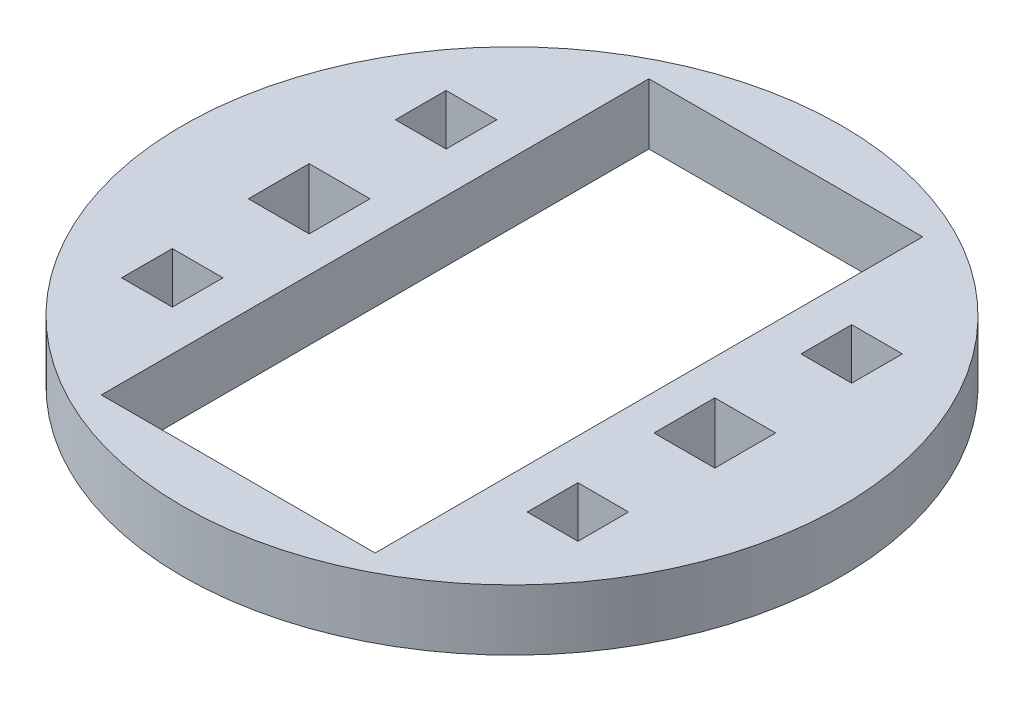
ISO-10303-21;
HEADER;
FILE_DESCRIPTION(('STEP AP214'),'2;1');
FILE_NAME('part.step','',(''),(''),'','','');
FILE_SCHEMA(('AUTOMOTIVE_DESIGN { 1 0 10303 214 1 1 1 1 }'));
ENDSEC;
DATA;
#1=APPLICATION_CONTEXT('core data for automotive mechanical design processes');
#2=APPLICATION_PROTOCOL_DEFINITION('international standard','automotive_design',2000,#1);
#3=PRODUCT_CONTEXT('',#1,'mechanical');
#4=PRODUCT('Part','Part','',(#3));
#5=PRODUCT_RELATED_PRODUCT_CATEGORY('part','',(#4));
#6=PRODUCT_DEFINITION_FORMATION('','',#4);
#7=PRODUCT_DEFINITION_CONTEXT('part definition',#1,'design');
#8=PRODUCT_DEFINITION('design','',#6,#7);
#9=PRODUCT_DEFINITION_SHAPE('','',#8);
#10=(LENGTH_UNIT() NAMED_UNIT(*) SI_UNIT(.MILLI.,.METRE.));
#11=(NAMED_UNIT(*) PLANE_ANGLE_UNIT() SI_UNIT($,.RADIAN.));
#12=(NAMED_UNIT(*) SI_UNIT($,.STERADIAN.) SOLID_ANGLE_UNIT());
#13=UNCERTAINTY_MEASURE_WITH_UNIT(LENGTH_MEASURE(1.E-05),#10,'distance_accuracy_value','');
#14=(GEOMETRIC_REPRESENTATION_CONTEXT(3) GLOBAL_UNCERTAINTY_ASSIGNED_CONTEXT((#13)) GLOBAL_UNIT_ASSIGNED_CONTEXT((#10,
#11,#12)) REPRESENTATION_CONTEXT('',''));
#15=CARTESIAN_POINT('',(0.,0.,0.));
#16=DIRECTION('',(0.,0.,1.));
#17=DIRECTION('',(1.,0.,0.));
#18=AXIS2_PLACEMENT_3D('',#15,#16,#17);
#19=CARTESIAN_POINT('',(0.,6.,0.));
#20=DIRECTION('',(0.,1.,0.));
#21=DIRECTION('',(0.,0.,1.));
#22=AXIS2_PLACEMENT_3D('',#19,#20,#21);
#23=PLANE('',#22);
#24=DIRECTION('',(0.,0.,1.));
#25=VECTOR('',#24,1.);
#26=CARTESIAN_POINT('',(17.5,6.,-16.));
#27=LINE('',#26,#25);
#28=CARTESIAN_POINT('',(17.5,6.,-16.));
#29=VERTEX_POINT('',#28);
#30=CARTESIAN_POINT('',(17.5,6.,-11.));
#31=VERTEX_POINT('',#30);
#32=EDGE_CURVE('E61',#29,#31,#27,.T.);
#33=ORIENTED_EDGE('',*,*,#32,.F.);
#34=DIRECTION('',(-1.,0.,0.));
#35=VECTOR('',#34,1.);
#36=CARTESIAN_POINT('',(22.5,6.,-16.));
#37=LINE('',#36,#35);
#38=CARTESIAN_POINT('',(22.5,6.,-16.));
#39=VERTEX_POINT('',#38);
#40=EDGE_CURVE('E294',#39,#29,#37,.T.);
#41=ORIENTED_EDGE('',*,*,#40,.F.);
#42=DIRECTION('',(0.,0.,-1.));
#43=VECTOR('',#42,1.);
#44=CARTESIAN_POINT('',(22.5,6.,-16.));
#45=LINE('',#44,#43);
#46=CARTESIAN_POINT('',(22.5,6.,-11.));
#47=VERTEX_POINT('',#46);
#48=EDGE_CURVE('E291',#47,#39,#45,.T.);
#49=ORIENTED_EDGE('',*,*,#48,.F.);
#50=DIRECTION('',(1.,0.,0.));
#51=VECTOR('',#50,1.);
#52=CARTESIAN_POINT('',(22.5,6.,-11.));
#53=LINE('',#52,#51);
#54=EDGE_CURVE('E288',#31,#47,#53,.T.);
#55=ORIENTED_EDGE('',*,*,#54,.F.);
#56=EDGE_LOOP('',(#33,#41,#49,#55));
#57=FACE_BOUND('',#56,.T.);
#58=DIRECTION('',(0.,0.,1.));
#59=VECTOR('',#58,1.);
#60=CARTESIAN_POINT('',(17.5,6.,11.));
#61=LINE('',#60,#59);
#62=CARTESIAN_POINT('',(17.5,6.,11.));
#63=VERTEX_POINT('',#62);
#64=CARTESIAN_POINT('',(17.5,6.,16.));
#65=VERTEX_POINT('',#64);
#66=EDGE_CURVE('E69',#63,#65,#61,.T.);
#67=ORIENTED_EDGE('',*,*,#66,.F.);
#68=DIRECTION('',(-1.,0.,0.));
#69=VECTOR('',#68,1.);
#70=CARTESIAN_POINT('',(22.5,6.,11.));
#71=LINE('',#70,#69);
#72=CARTESIAN_POINT('',(22.5,6.,11.));
#73=VERTEX_POINT('',#72);
#74=EDGE_CURVE('E276',#73,#63,#71,.T.);
#75=ORIENTED_EDGE('',*,*,#74,.F.);
#76=DIRECTION('',(0.,0.,-1.));
#77=VECTOR('',#76,1.);
#78=CARTESIAN_POINT('',(22.5,6.,11.));
#79=LINE('',#78,#77);
#80=CARTESIAN_POINT('',(22.5,6.,16.));
#81=VERTEX_POINT('',#80);
#82=EDGE_CURVE('E273',#81,#73,#79,.T.);
#83=ORIENTED_EDGE('',*,*,#82,.F.);
#84=DIRECTION('',(1.,0.,0.));
#85=VECTOR('',#84,1.);
#86=CARTESIAN_POINT('',(22.5,6.,16.));
#87=LINE('',#86,#85);
#88=EDGE_CURVE('E269',#65,#81,#87,.T.);
#89=ORIENTED_EDGE('',*,*,#88,.F.);
#90=EDGE_LOOP('',(#67,#75,#83,#89));
#91=FACE_BOUND('',#90,.T.);
#92=DIRECTION('',(0.,0.,1.));
#93=VECTOR('',#92,1.);
#94=CARTESIAN_POINT('',(-22.5,6.,11.));
#95=LINE('',#94,#93);
#96=CARTESIAN_POINT('',(-22.5,6.,11.));
#97=VERTEX_POINT('',#96);
#98=CARTESIAN_POINT('',(-22.5,6.,16.));
#99=VERTEX_POINT('',#98);
#100=EDGE_CURVE('E254',#97,#99,#95,.T.);
#101=ORIENTED_EDGE('',*,*,#100,.F.);
#102=DIRECTION('',(-1.,0.,0.));
#103=VECTOR('',#102,1.);
#104=CARTESIAN_POINT('',(-17.5,6.,11.));
#105=LINE('',#104,#103);
#106=CARTESIAN_POINT('',(-17.5,6.,11.));
#107=VERTEX_POINT('',#106);
#108=EDGE_CURVE('E258',#107,#97,#105,.T.);
#109=ORIENTED_EDGE('',*,*,#108,.F.);
#110=DIRECTION('',(0.,0.,-1.));
#111=VECTOR('',#110,1.);
#112=CARTESIAN_POINT('',(-17.5,6.,11.));
#113=LINE('',#112,#111);
#114=CARTESIAN_POINT('',(-17.5,6.,16.));
#115=VERTEX_POINT('',#114);
#116=EDGE_CURVE('E238',#115,#107,#113,.T.);
#117=ORIENTED_EDGE('',*,*,#116,.F.);
#118=DIRECTION('',(1.,0.,0.));
#119=VECTOR('',#118,1.);
#120=CARTESIAN_POINT('',(-17.5,6.,16.));
#121=LINE('',#120,#119);
#122=EDGE_CURVE('E249',#99,#115,#121,.T.);
#123=ORIENTED_EDGE('',*,*,#122,.F.);
#124=EDGE_LOOP('',(#101,#109,#117,#123));
#125=FACE_BOUND('',#124,.T.);
#126=DIRECTION('',(0.,0.,1.));
#127=VECTOR('',#126,1.);
#128=CARTESIAN_POINT('',(-22.5,6.,-16.));
#129=LINE('',#128,#127);
#130=CARTESIAN_POINT('',(-22.5,6.,-16.));
#131=VERTEX_POINT('',#130);
#132=CARTESIAN_POINT('',(-22.5,6.,-11.));
#133=VERTEX_POINT('',#132);
#134=EDGE_CURVE('E265',#131,#133,#129,.T.);
#135=ORIENTED_EDGE('',*,*,#134,.F.);
#136=DIRECTION('',(-1.,0.,0.));
#137=VECTOR('',#136,1.);
#138=CARTESIAN_POINT('',(-17.5,6.,-16.));
#139=LINE('',#138,#137);
#140=CARTESIAN_POINT('',(-17.5,6.,-16.));
#141=VERTEX_POINT('',#140);
#142=EDGE_CURVE('E311',#141,#131,#139,.T.);
#143=ORIENTED_EDGE('',*,*,#142,.F.);
#144=DIRECTION('',(0.,0.,-1.));
#145=VECTOR('',#144,1.);
#146=CARTESIAN_POINT('',(-17.5,6.,-16.));
#147=LINE('',#146,#145);
#148=CARTESIAN_POINT('',(-17.5,6.,-11.));
#149=VERTEX_POINT('',#148);
#150=EDGE_CURVE('E308',#149,#141,#147,.T.);
#151=ORIENTED_EDGE('',*,*,#150,.F.);
#152=DIRECTION('',(1.,0.,0.));
#153=VECTOR('',#152,1.);
#154=CARTESIAN_POINT('',(-17.5,6.,-11.));
#155=LINE('',#154,#153);
#156=EDGE_CURVE('E305',#133,#149,#155,.T.);
#157=ORIENTED_EDGE('',*,*,#156,.F.);
#158=EDGE_LOOP('',(#135,#143,#151,#157));
#159=FACE_BOUND('',#158,.T.);
#160=CARTESIAN_POINT('',(0.,6.,0.));
#161=DIRECTION('',(0.,1.,0.));
#162=DIRECTION('',(0.,0.,1.));
#163=AXIS2_PLACEMENT_3D('',#160,#161,#162);
#164=CIRCLE('',#163,32.5);
#165=CARTESIAN_POINT('',(0.,6.,32.5));
#166=VERTEX_POINT('',#165);
#167=EDGE_CURVE('E417',#166,#166,#164,.T.);
#168=ORIENTED_EDGE('',*,*,#167,.T.);
#169=EDGE_LOOP('',(#168));
#170=FACE_BOUND('',#169,.T.);
#171=DIRECTION('',(-1.,0.,0.));
#172=VECTOR('',#171,1.);
#173=CARTESIAN_POINT('',(-13.5,6.,-27.));
#174=LINE('',#173,#172);
#175=CARTESIAN_POINT('',(13.5,6.,-27.));
#176=VERTEX_POINT('',#175);
#177=CARTESIAN_POINT('',(-13.5,6.,-27.));
#178=VERTEX_POINT('',#177);
#179=EDGE_CURVE('E388',#176,#178,#174,.T.);
#180=ORIENTED_EDGE('',*,*,#179,.F.);
#181=DIRECTION('',(0.,0.,-1.));
#182=VECTOR('',#181,1.);
#183=CARTESIAN_POINT('',(13.5,6.,-27.));
#184=LINE('',#183,#182);
#185=CARTESIAN_POINT('',(13.5,6.,27.));
#186=VERTEX_POINT('',#185);
#187=EDGE_CURVE('E386',#186,#176,#184,.T.);
#188=ORIENTED_EDGE('',*,*,#187,.F.);
#189=DIRECTION('',(1.,0.,0.));
#190=VECTOR('',#189,1.);
#191=CARTESIAN_POINT('',(-13.5,6.,27.));
#192=LINE('',#191,#190);
#193=CARTESIAN_POINT('',(-13.5,6.,27.));
#194=VERTEX_POINT('',#193);
#195=EDGE_CURVE('E394',#194,#186,#192,.T.);
#196=ORIENTED_EDGE('',*,*,#195,.F.);
#197=DIRECTION('',(0.,0.,1.));
#198=VECTOR('',#197,1.);
#199=CARTESIAN_POINT('',(-13.5,6.,-27.));
#200=LINE('',#199,#198);
#201=EDGE_CURVE('E391',#178,#194,#200,.T.);
#202=ORIENTED_EDGE('',*,*,#201,.F.);
#203=EDGE_LOOP('',(#180,#188,#196,#202));
#204=FACE_BOUND('',#203,.T.);
#205=DIRECTION('',(1.,0.,0.));
#206=VECTOR('',#205,1.);
#207=CARTESIAN_POINT('',(-17.,6.,3.));
#208=LINE('',#207,#206);
#209=CARTESIAN_POINT('',(-23.,6.,3.));
#210=VERTEX_POINT('',#209);
#211=CARTESIAN_POINT('',(-17.,6.,3.));
#212=VERTEX_POINT('',#211);
#213=EDGE_CURVE('E357',#210,#212,#208,.T.);
#214=ORIENTED_EDGE('',*,*,#213,.F.);
#215=DIRECTION('',(0.,0.,1.));
#216=VECTOR('',#215,1.);
#217=CARTESIAN_POINT('',(-23.,6.,-3.));
#218=LINE('',#217,#216);
#219=CARTESIAN_POINT('',(-23.,6.,-3.));
#220=VERTEX_POINT('',#219);
#221=EDGE_CURVE('E355',#220,#210,#218,.T.);
#222=ORIENTED_EDGE('',*,*,#221,.F.);
#223=DIRECTION('',(-1.,0.,0.));
#224=VECTOR('',#223,1.);
#225=CARTESIAN_POINT('',(-17.,6.,-3.));
#226=LINE('',#225,#224);
#227=CARTESIAN_POINT('',(-17.,6.,-3.));
#228=VERTEX_POINT('',#227);
#229=EDGE_CURVE('E363',#228,#220,#226,.T.);
#230=ORIENTED_EDGE('',*,*,#229,.F.);
#231=DIRECTION('',(0.,0.,-1.));
#232=VECTOR('',#231,1.);
#233=CARTESIAN_POINT('',(-17.,6.,-3.));
#234=LINE('',#233,#232);
#235=EDGE_CURVE('E360',#212,#228,#234,.T.);
#236=ORIENTED_EDGE('',*,*,#235,.F.);
#237=EDGE_LOOP('',(#214,#222,#230,#236));
#238=FACE_BOUND('',#237,.T.);
#239=DIRECTION('',(-1.,0.,0.));
#240=VECTOR('',#239,1.);
#241=CARTESIAN_POINT('',(17.,6.,-2.99999999999999));
#242=LINE('',#241,#240);
#243=CARTESIAN_POINT('',(23.,6.,-3.));
#244=VERTEX_POINT('',#243);
#245=CARTESIAN_POINT('',(17.,6.,-2.99999999999999));
#246=VERTEX_POINT('',#245);
#247=EDGE_CURVE('E326',#244,#246,#242,.T.);
#248=ORIENTED_EDGE('',*,*,#247,.F.);
#249=DIRECTION('',(0.,0.,-1.));
#250=VECTOR('',#249,1.);
#251=CARTESIAN_POINT('',(23.,6.,3.00000000000001));
#252=LINE('',#251,#250);
#253=CARTESIAN_POINT('',(23.,6.,3.00000000000001));
#254=VERTEX_POINT('',#253);
#255=EDGE_CURVE('E324',#254,#244,#252,.T.);
#256=ORIENTED_EDGE('',*,*,#255,.F.);
#257=DIRECTION('',(1.,0.,0.));
#258=VECTOR('',#257,1.);
#259=CARTESIAN_POINT('',(17.,6.,3.00000000000001));
#260=LINE('',#259,#258);
#261=CARTESIAN_POINT('',(17.,6.,3.00000000000001));
#262=VERTEX_POINT('',#261);
#263=EDGE_CURVE('E332',#262,#254,#260,.T.);
#264=ORIENTED_EDGE('',*,*,#263,.F.);
#265=DIRECTION('',(0.,0.,1.));
#266=VECTOR('',#265,1.);
#267=CARTESIAN_POINT('',(17.,6.,3.00000000000001));
#268=LINE('',#267,#266);
#269=EDGE_CURVE('E329',#246,#262,#268,.T.);
#270=ORIENTED_EDGE('',*,*,#269,.F.);
#271=EDGE_LOOP('',(#248,#256,#264,#270));
#272=FACE_BOUND('',#271,.T.);
#273=ADVANCED_FACE('F46',(#57,#91,#125,#159,#170,#204,#238,#272),#23,.T.);
#274=CARTESIAN_POINT('',(0.,0.,0.));
#275=DIRECTION('',(0.,1.,0.));
#276=DIRECTION('',(0.,0.,1.));
#277=AXIS2_PLACEMENT_3D('',#274,#275,#276);
#278=PLANE('',#277);
#279=DIRECTION('',(-1.,0.,0.));
#280=VECTOR('',#279,1.);
#281=CARTESIAN_POINT('',(0.,0.,-16.));
#282=LINE('',#281,#280);
#283=CARTESIAN_POINT('',(22.5,0.,-16.));
#284=VERTEX_POINT('',#283);
#285=CARTESIAN_POINT('',(17.5,0.,-16.));
#286=VERTEX_POINT('',#285);
#287=EDGE_CURVE('E54',#284,#286,#282,.T.);
#288=ORIENTED_EDGE('',*,*,#287,.T.);
#289=DIRECTION('',(0.,0.,1.));
#290=VECTOR('',#289,1.);
#291=CARTESIAN_POINT('',(17.5,0.,0.));
#292=LINE('',#291,#290);
#293=CARTESIAN_POINT('',(17.5,0.,-11.));
#294=VERTEX_POINT('',#293);
#295=EDGE_CURVE('E13',#286,#294,#292,.T.);
#296=ORIENTED_EDGE('',*,*,#295,.T.);
#297=DIRECTION('',(1.,0.,0.));
#298=VECTOR('',#297,1.);
#299=CARTESIAN_POINT('',(0.,0.,-11.));
#300=LINE('',#299,#298);
#301=CARTESIAN_POINT('',(22.5,0.,-11.));
#302=VERTEX_POINT('',#301);
#303=EDGE_CURVE('E455',#294,#302,#300,.T.);
#304=ORIENTED_EDGE('',*,*,#303,.T.);
#305=DIRECTION('',(0.,0.,-1.));
#306=VECTOR('',#305,1.);
#307=CARTESIAN_POINT('',(22.5,0.,0.));
#308=LINE('',#307,#306);
#309=EDGE_CURVE('E458',#302,#284,#308,.T.);
#310=ORIENTED_EDGE('',*,*,#309,.T.);
#311=EDGE_LOOP('',(#288,#296,#304,#310));
#312=FACE_BOUND('',#311,.T.);
#313=DIRECTION('',(-1.,0.,0.));
#314=VECTOR('',#313,1.);
#315=CARTESIAN_POINT('',(0.,0.,11.));
#316=LINE('',#315,#314);
#317=CARTESIAN_POINT('',(22.5,0.,11.));
#318=VERTEX_POINT('',#317);
#319=CARTESIAN_POINT('',(17.5,0.,11.));
#320=VERTEX_POINT('',#319);
#321=EDGE_CURVE('E449',#318,#320,#316,.T.);
#322=ORIENTED_EDGE('',*,*,#321,.T.);
#323=DIRECTION('',(0.,0.,1.));
#324=VECTOR('',#323,1.);
#325=CARTESIAN_POINT('',(17.5,0.,0.));
#326=LINE('',#325,#324);
#327=CARTESIAN_POINT('',(17.5,0.,16.));
#328=VERTEX_POINT('',#327);
#329=EDGE_CURVE('E452',#320,#328,#326,.T.);
#330=ORIENTED_EDGE('',*,*,#329,.T.);
#331=DIRECTION('',(1.,0.,0.));
#332=VECTOR('',#331,1.);
#333=CARTESIAN_POINT('',(0.,0.,16.));
#334=LINE('',#333,#332);
#335=CARTESIAN_POINT('',(22.5,0.,16.));
#336=VERTEX_POINT('',#335);
#337=EDGE_CURVE('E443',#328,#336,#334,.T.);
#338=ORIENTED_EDGE('',*,*,#337,.T.);
#339=DIRECTION('',(0.,0.,-1.));
#340=VECTOR('',#339,1.);
#341=CARTESIAN_POINT('',(22.5,0.,0.));
#342=LINE('',#341,#340);
#343=EDGE_CURVE('E446',#336,#318,#342,.T.);
#344=ORIENTED_EDGE('',*,*,#343,.T.);
#345=EDGE_LOOP('',(#322,#330,#338,#344));
#346=FACE_BOUND('',#345,.T.);
#347=DIRECTION('',(-1.,0.,0.));
#348=VECTOR('',#347,1.);
#349=CARTESIAN_POINT('',(0.,0.,11.));
#350=LINE('',#349,#348);
#351=CARTESIAN_POINT('',(-17.5,0.,11.));
#352=VERTEX_POINT('',#351);
#353=CARTESIAN_POINT('',(-22.5,0.,11.));
#354=VERTEX_POINT('',#353);
#355=EDGE_CURVE('E437',#352,#354,#350,.T.);
#356=ORIENTED_EDGE('',*,*,#355,.T.);
#357=DIRECTION('',(0.,0.,1.));
#358=VECTOR('',#357,1.);
#359=CARTESIAN_POINT('',(-22.5,0.,0.));
#360=LINE('',#359,#358);
#361=CARTESIAN_POINT('',(-22.5,0.,16.));
#362=VERTEX_POINT('',#361);
#363=EDGE_CURVE('E440',#354,#362,#360,.T.);
#364=ORIENTED_EDGE('',*,*,#363,.T.);
#365=DIRECTION('',(1.,0.,0.));
#366=VECTOR('',#365,1.);
#367=CARTESIAN_POINT('',(0.,0.,16.));
#368=LINE('',#367,#366);
#369=CARTESIAN_POINT('',(-17.5,0.,16.));
#370=VERTEX_POINT('',#369);
#371=EDGE_CURVE('E434',#362,#370,#368,.T.);
#372=ORIENTED_EDGE('',*,*,#371,.T.);
#373=DIRECTION('',(0.,0.,-1.));
#374=VECTOR('',#373,1.);
#375=CARTESIAN_POINT('',(-17.5,0.,0.));
#376=LINE('',#375,#374);
#377=EDGE_CURVE('E241',#370,#352,#376,.T.);
#378=ORIENTED_EDGE('',*,*,#377,.T.);
#379=EDGE_LOOP('',(#356,#364,#372,#378));
#380=FACE_BOUND('',#379,.T.);
#381=DIRECTION('',(-1.,0.,0.));
#382=VECTOR('',#381,1.);
#383=CARTESIAN_POINT('',(0.,0.,-16.));
#384=LINE('',#383,#382);
#385=CARTESIAN_POINT('',(-17.5,0.,-16.));
#386=VERTEX_POINT('',#385);
#387=CARTESIAN_POINT('',(-22.5,0.,-16.));
#388=VERTEX_POINT('',#387);
#389=EDGE_CURVE('E428',#386,#388,#384,.T.);
#390=ORIENTED_EDGE('',*,*,#389,.T.);
#391=DIRECTION('',(0.,0.,1.));
#392=VECTOR('',#391,1.);
#393=CARTESIAN_POINT('',(-22.5,0.,0.));
#394=LINE('',#393,#392);
#395=CARTESIAN_POINT('',(-22.5,0.,-11.));
#396=VERTEX_POINT('',#395);
#397=EDGE_CURVE('E431',#388,#396,#394,.T.);
#398=ORIENTED_EDGE('',*,*,#397,.T.);
#399=DIRECTION('',(1.,0.,0.));
#400=VECTOR('',#399,1.);
#401=CARTESIAN_POINT('',(0.,0.,-11.));
#402=LINE('',#401,#400);
#403=CARTESIAN_POINT('',(-17.5,0.,-11.));
#404=VERTEX_POINT('',#403);
#405=EDGE_CURVE('E420',#396,#404,#402,.T.);
#406=ORIENTED_EDGE('',*,*,#405,.T.);
#407=DIRECTION('',(0.,0.,-1.));
#408=VECTOR('',#407,1.);
#409=CARTESIAN_POINT('',(-17.5,0.,0.));
#410=LINE('',#409,#408);
#411=EDGE_CURVE('E425',#404,#386,#410,.T.);
#412=ORIENTED_EDGE('',*,*,#411,.T.);
#413=EDGE_LOOP('',(#390,#398,#406,#412));
#414=FACE_BOUND('',#413,.T.);
#415=DIRECTION('',(0.,0.,1.));
#416=VECTOR('',#415,1.);
#417=CARTESIAN_POINT('',(-23.,0.,-3.));
#418=LINE('',#417,#416);
#419=CARTESIAN_POINT('',(-23.,0.,-3.));
#420=VERTEX_POINT('',#419);
#421=CARTESIAN_POINT('',(-23.,0.,3.));
#422=VERTEX_POINT('',#421);
#423=EDGE_CURVE('E354',#420,#422,#418,.T.);
#424=ORIENTED_EDGE('',*,*,#423,.T.);
#425=DIRECTION('',(1.,0.,0.));
#426=VECTOR('',#425,1.);
#427=CARTESIAN_POINT('',(-17.,0.,3.));
#428=LINE('',#427,#426);
#429=CARTESIAN_POINT('',(-17.,0.,3.));
#430=VERTEX_POINT('',#429);
#431=EDGE_CURVE('E368',#422,#430,#428,.T.);
#432=ORIENTED_EDGE('',*,*,#431,.T.);
#433=DIRECTION('',(0.,0.,-1.));
#434=VECTOR('',#433,1.);
#435=CARTESIAN_POINT('',(-17.,0.,-3.));
#436=LINE('',#435,#434);
#437=CARTESIAN_POINT('',(-17.,0.,-3.));
#438=VERTEX_POINT('',#437);
#439=EDGE_CURVE('E371',#430,#438,#436,.T.);
#440=ORIENTED_EDGE('',*,*,#439,.T.);
#441=DIRECTION('',(-1.,0.,0.));
#442=VECTOR('',#441,1.);
#443=CARTESIAN_POINT('',(-17.,0.,-3.));
#444=LINE('',#443,#442);
#445=EDGE_CURVE('E358',#438,#420,#444,.T.);
#446=ORIENTED_EDGE('',*,*,#445,.T.);
#447=EDGE_LOOP('',(#424,#432,#440,#446));
#448=FACE_BOUND('',#447,.T.);
#449=CARTESIAN_POINT('',(0.,0.,0.));
#450=DIRECTION('',(0.,1.,0.));
#451=DIRECTION('',(0.,0.,1.));
#452=AXIS2_PLACEMENT_3D('',#449,#450,#451);
#453=CIRCLE('',#452,32.5);
#454=CARTESIAN_POINT('',(0.,0.,32.5));
#455=VERTEX_POINT('',#454);
#456=EDGE_CURVE('E416',#455,#455,#453,.T.);
#457=ORIENTED_EDGE('',*,*,#456,.F.);
#458=EDGE_LOOP('',(#457));
#459=FACE_BOUND('',#458,.T.);
#460=DIRECTION('',(0.,0.,-1.));
#461=VECTOR('',#460,1.);
#462=CARTESIAN_POINT('',(13.5,0.,-27.));
#463=LINE('',#462,#461);
#464=CARTESIAN_POINT('',(13.5,0.,27.));
#465=VERTEX_POINT('',#464);
#466=CARTESIAN_POINT('',(13.5,0.,-27.));
#467=VERTEX_POINT('',#466);
#468=EDGE_CURVE('E385',#465,#467,#463,.T.);
#469=ORIENTED_EDGE('',*,*,#468,.T.);
#470=DIRECTION('',(-1.,0.,0.));
#471=VECTOR('',#470,1.);
#472=CARTESIAN_POINT('',(-13.5,0.,-27.));
#473=LINE('',#472,#471);
#474=CARTESIAN_POINT('',(-13.5,0.,-27.));
#475=VERTEX_POINT('',#474);
#476=EDGE_CURVE('E399',#467,#475,#473,.T.);
#477=ORIENTED_EDGE('',*,*,#476,.T.);
#478=DIRECTION('',(0.,0.,1.));
#479=VECTOR('',#478,1.);
#480=CARTESIAN_POINT('',(-13.5,0.,-27.));
#481=LINE('',#480,#479);
#482=CARTESIAN_POINT('',(-13.5,0.,27.));
#483=VERTEX_POINT('',#482);
#484=EDGE_CURVE('E402',#475,#483,#481,.T.);
#485=ORIENTED_EDGE('',*,*,#484,.T.);
#486=DIRECTION('',(1.,0.,0.));
#487=VECTOR('',#486,1.);
#488=CARTESIAN_POINT('',(-13.5,0.,27.));
#489=LINE('',#488,#487);
#490=EDGE_CURVE('E389',#483,#465,#489,.T.);
#491=ORIENTED_EDGE('',*,*,#490,.T.);
#492=EDGE_LOOP('',(#469,#477,#485,#491));
#493=FACE_BOUND('',#492,.T.);
#494=DIRECTION('',(0.,0.,-1.));
#495=VECTOR('',#494,1.);
#496=CARTESIAN_POINT('',(23.,0.,3.00000000000001));
#497=LINE('',#496,#495);
#498=CARTESIAN_POINT('',(23.,0.,3.00000000000001));
#499=VERTEX_POINT('',#498);
#500=CARTESIAN_POINT('',(23.,0.,-3.));
#501=VERTEX_POINT('',#500);
#502=EDGE_CURVE('E317',#499,#501,#497,.T.);
#503=ORIENTED_EDGE('',*,*,#502,.T.);
#504=DIRECTION('',(-1.,0.,0.));
#505=VECTOR('',#504,1.);
#506=CARTESIAN_POINT('',(17.,0.,-2.99999999999999));
#507=LINE('',#506,#505);
#508=CARTESIAN_POINT('',(17.,0.,-2.99999999999999));
#509=VERTEX_POINT('',#508);
#510=EDGE_CURVE('E337',#501,#509,#507,.T.);
#511=ORIENTED_EDGE('',*,*,#510,.T.);
#512=DIRECTION('',(0.,0.,1.));
#513=VECTOR('',#512,1.);
#514=CARTESIAN_POINT('',(17.,0.,3.00000000000001));
#515=LINE('',#514,#513);
#516=CARTESIAN_POINT('',(17.,0.,3.00000000000001));
#517=VERTEX_POINT('',#516);
#518=EDGE_CURVE('E340',#509,#517,#515,.T.);
#519=ORIENTED_EDGE('',*,*,#518,.T.);
#520=DIRECTION('',(1.,0.,0.));
#521=VECTOR('',#520,1.);
#522=CARTESIAN_POINT('',(17.,0.,3.00000000000001));
#523=LINE('',#522,#521);
#524=EDGE_CURVE('E327',#517,#499,#523,.T.);
#525=ORIENTED_EDGE('',*,*,#524,.T.);
#526=EDGE_LOOP('',(#503,#511,#519,#525));
#527=FACE_BOUND('',#526,.T.);
#528=ADVANCED_FACE('F462',(#312,#346,#380,#414,#448,#459,#493,#527),#278,.F.);
#529=CARTESIAN_POINT('',(0.,6.,0.));
#530=DIRECTION('',(0.,-1.,0.));
#531=DIRECTION('',(0.,0.,-1.));
#532=AXIS2_PLACEMENT_3D('',#529,#530,#531);
#533=CYLINDRICAL_SURFACE('',#532,32.5);
#534=ORIENTED_EDGE('',*,*,#167,.F.);
#535=EDGE_LOOP('',(#534));
#536=FACE_BOUND('',#535,.T.);
#537=ORIENTED_EDGE('',*,*,#456,.T.);
#538=EDGE_LOOP('',(#537));
#539=FACE_BOUND('',#538,.T.);
#540=ADVANCED_FACE('F48',(#536,#539),#533,.T.);
#541=CARTESIAN_POINT('',(13.5,6.,-27.));
#542=DIRECTION('',(-1.,0.,0.));
#543=DIRECTION('',(0.,0.,1.));
#544=AXIS2_PLACEMENT_3D('',#541,#542,#543);
#545=PLANE('',#544);
#546=ORIENTED_EDGE('',*,*,#468,.F.);
#547=DIRECTION('',(0.,-1.,0.));
#548=VECTOR('',#547,1.);
#549=CARTESIAN_POINT('',(13.5,6.,27.));
#550=LINE('',#549,#548);
#551=EDGE_CURVE('E396',#186,#465,#550,.T.);
#552=ORIENTED_EDGE('',*,*,#551,.F.);
#553=ORIENTED_EDGE('',*,*,#187,.T.);
#554=DIRECTION('',(0.,-1.,0.));
#555=VECTOR('',#554,1.);
#556=CARTESIAN_POINT('',(13.5,6.,-27.));
#557=LINE('',#556,#555);
#558=EDGE_CURVE('E413',#176,#467,#557,.T.);
#559=ORIENTED_EDGE('',*,*,#558,.T.);
#560=EDGE_LOOP('',(#546,#552,#553,#559));
#561=FACE_BOUND('',#560,.T.);
#562=ADVANCED_FACE('F498',(#561),#545,.T.);
#563=CARTESIAN_POINT('',(-13.5,6.,-27.));
#564=DIRECTION('',(0.,0.,1.));
#565=DIRECTION('',(1.,0.,0.));
#566=AXIS2_PLACEMENT_3D('',#563,#564,#565);
#567=PLANE('',#566);
#568=ORIENTED_EDGE('',*,*,#476,.F.);
#569=ORIENTED_EDGE('',*,*,#558,.F.);
#570=ORIENTED_EDGE('',*,*,#179,.T.);
#571=DIRECTION('',(0.,-1.,0.));
#572=VECTOR('',#571,1.);
#573=CARTESIAN_POINT('',(-13.5,6.,-27.));
#574=LINE('',#573,#572);
#575=EDGE_CURVE('E411',#178,#475,#574,.T.);
#576=ORIENTED_EDGE('',*,*,#575,.T.);
#577=EDGE_LOOP('',(#568,#569,#570,#576));
#578=FACE_BOUND('',#577,.T.);
#579=ADVANCED_FACE('F501',(#578),#567,.T.);
#580=CARTESIAN_POINT('',(-13.5,6.,-27.));
#581=DIRECTION('',(1.,0.,0.));
#582=DIRECTION('',(0.,0.,-1.));
#583=AXIS2_PLACEMENT_3D('',#580,#581,#582);
#584=PLANE('',#583);
#585=ORIENTED_EDGE('',*,*,#484,.F.);
#586=ORIENTED_EDGE('',*,*,#575,.F.);
#587=ORIENTED_EDGE('',*,*,#201,.T.);
#588=DIRECTION('',(0.,-1.,0.));
#589=VECTOR('',#588,1.);
#590=CARTESIAN_POINT('',(-13.5,6.,27.));
#591=LINE('',#590,#589);
#592=EDGE_CURVE('E409',#194,#483,#591,.T.);
#593=ORIENTED_EDGE('',*,*,#592,.T.);
#594=EDGE_LOOP('',(#585,#586,#587,#593));
#595=FACE_BOUND('',#594,.T.);
#596=ADVANCED_FACE('F505',(#595),#584,.T.);
#597=CARTESIAN_POINT('',(-13.5,6.,27.));
#598=DIRECTION('',(0.,0.,-1.));
#599=DIRECTION('',(-1.,0.,0.));
#600=AXIS2_PLACEMENT_3D('',#597,#598,#599);
#601=PLANE('',#600);
#602=ORIENTED_EDGE('',*,*,#490,.F.);
#603=ORIENTED_EDGE('',*,*,#592,.F.);
#604=ORIENTED_EDGE('',*,*,#195,.T.);
#605=ORIENTED_EDGE('',*,*,#551,.T.);
#606=EDGE_LOOP('',(#602,#603,#604,#605));
#607=FACE_BOUND('',#606,.T.);
#608=ADVANCED_FACE('F509',(#607),#601,.T.);
#609=CARTESIAN_POINT('',(-23.,6.,-3.));
#610=DIRECTION('',(1.,0.,0.));
#611=DIRECTION('',(0.,0.,-1.));
#612=AXIS2_PLACEMENT_3D('',#609,#610,#611);
#613=PLANE('',#612);
#614=ORIENTED_EDGE('',*,*,#423,.F.);
#615=DIRECTION('',(0.,-1.,0.));
#616=VECTOR('',#615,1.);
#617=CARTESIAN_POINT('',(-23.,6.,-3.));
#618=LINE('',#617,#616);
#619=EDGE_CURVE('E365',#220,#420,#618,.T.);
#620=ORIENTED_EDGE('',*,*,#619,.F.);
#621=ORIENTED_EDGE('',*,*,#221,.T.);
#622=DIRECTION('',(0.,-1.,0.));
#623=VECTOR('',#622,1.);
#624=CARTESIAN_POINT('',(-23.,6.,3.));
#625=LINE('',#624,#623);
#626=EDGE_CURVE('E382',#210,#422,#625,.T.);
#627=ORIENTED_EDGE('',*,*,#626,.T.);
#628=EDGE_LOOP('',(#614,#620,#621,#627));
#629=FACE_BOUND('',#628,.T.);
#630=ADVANCED_FACE('F513',(#629),#613,.T.);
#631=CARTESIAN_POINT('',(-17.,6.,3.));
#632=DIRECTION('',(0.,0.,-1.));
#633=DIRECTION('',(-1.,0.,0.));
#634=AXIS2_PLACEMENT_3D('',#631,#632,#633);
#635=PLANE('',#634);
#636=ORIENTED_EDGE('',*,*,#431,.F.);
#637=ORIENTED_EDGE('',*,*,#626,.F.);
#638=ORIENTED_EDGE('',*,*,#213,.T.);
#639=DIRECTION('',(0.,-1.,0.));
#640=VECTOR('',#639,1.);
#641=CARTESIAN_POINT('',(-17.,6.,3.));
#642=LINE('',#641,#640);
#643=EDGE_CURVE('E380',#212,#430,#642,.T.);
#644=ORIENTED_EDGE('',*,*,#643,.T.);
#645=EDGE_LOOP('',(#636,#637,#638,#644));
#646=FACE_BOUND('',#645,.T.);
#647=ADVANCED_FACE('F517',(#646),#635,.T.);
#648=CARTESIAN_POINT('',(-17.,6.,-3.));
#649=DIRECTION('',(-1.,0.,0.));
#650=DIRECTION('',(0.,0.,1.));
#651=AXIS2_PLACEMENT_3D('',#648,#649,#650);
#652=PLANE('',#651);
#653=ORIENTED_EDGE('',*,*,#439,.F.);
#654=ORIENTED_EDGE('',*,*,#643,.F.);
#655=ORIENTED_EDGE('',*,*,#235,.T.);
#656=DIRECTION('',(0.,-1.,0.));
#657=VECTOR('',#656,1.);
#658=CARTESIAN_POINT('',(-17.,6.,-3.));
#659=LINE('',#658,#657);
#660=EDGE_CURVE('E378',#228,#438,#659,.T.);
#661=ORIENTED_EDGE('',*,*,#660,.T.);
#662=EDGE_LOOP('',(#653,#654,#655,#661));
#663=FACE_BOUND('',#662,.T.);
#664=ADVANCED_FACE('F521',(#663),#652,.T.);
#665=CARTESIAN_POINT('',(-17.,6.,-3.));
#666=DIRECTION('',(0.,0.,1.));
#667=DIRECTION('',(1.,0.,0.));
#668=AXIS2_PLACEMENT_3D('',#665,#666,#667);
#669=PLANE('',#668);
#670=ORIENTED_EDGE('',*,*,#445,.F.);
#671=ORIENTED_EDGE('',*,*,#660,.F.);
#672=ORIENTED_EDGE('',*,*,#229,.T.);
#673=ORIENTED_EDGE('',*,*,#619,.T.);
#674=EDGE_LOOP('',(#670,#671,#672,#673));
#675=FACE_BOUND('',#674,.T.);
#676=ADVANCED_FACE('F525',(#675),#669,.T.);
#677=CARTESIAN_POINT('',(23.,6.,3.00000000000001));
#678=DIRECTION('',(-1.,0.,0.));
#679=DIRECTION('',(0.,0.,1.));
#680=AXIS2_PLACEMENT_3D('',#677,#678,#679);
#681=PLANE('',#680);
#682=ORIENTED_EDGE('',*,*,#502,.F.);
#683=DIRECTION('',(0.,-1.,0.));
#684=VECTOR('',#683,1.);
#685=CARTESIAN_POINT('',(23.,6.,3.00000000000001));
#686=LINE('',#685,#684);
#687=EDGE_CURVE('E334',#254,#499,#686,.T.);
#688=ORIENTED_EDGE('',*,*,#687,.F.);
#689=ORIENTED_EDGE('',*,*,#255,.T.);
#690=DIRECTION('',(0.,-1.,0.));
#691=VECTOR('',#690,1.);
#692=CARTESIAN_POINT('',(23.,6.,-3.));
#693=LINE('',#692,#691);
#694=EDGE_CURVE('E351',#244,#501,#693,.T.);
#695=ORIENTED_EDGE('',*,*,#694,.T.);
#696=EDGE_LOOP('',(#682,#688,#689,#695));
#697=FACE_BOUND('',#696,.T.);
#698=ADVANCED_FACE('F529',(#697),#681,.T.);
#699=CARTESIAN_POINT('',(17.,6.,-2.99999999999999));
#700=DIRECTION('',(0.,0.,1.));
#701=DIRECTION('',(1.,0.,0.));
#702=AXIS2_PLACEMENT_3D('',#699,#700,#701);
#703=PLANE('',#702);
#704=ORIENTED_EDGE('',*,*,#510,.F.);
#705=ORIENTED_EDGE('',*,*,#694,.F.);
#706=ORIENTED_EDGE('',*,*,#247,.T.);
#707=DIRECTION('',(0.,-1.,0.));
#708=VECTOR('',#707,1.);
#709=CARTESIAN_POINT('',(17.,6.,-2.99999999999999));
#710=LINE('',#709,#708);
#711=EDGE_CURVE('E349',#246,#509,#710,.T.);
#712=ORIENTED_EDGE('',*,*,#711,.T.);
#713=EDGE_LOOP('',(#704,#705,#706,#712));
#714=FACE_BOUND('',#713,.T.);
#715=ADVANCED_FACE('F533',(#714),#703,.T.);
#716=CARTESIAN_POINT('',(17.,6.,3.00000000000001));
#717=DIRECTION('',(1.,0.,0.));
#718=DIRECTION('',(0.,0.,-1.));
#719=AXIS2_PLACEMENT_3D('',#716,#717,#718);
#720=PLANE('',#719);
#721=ORIENTED_EDGE('',*,*,#518,.F.);
#722=ORIENTED_EDGE('',*,*,#711,.F.);
#723=ORIENTED_EDGE('',*,*,#269,.T.);
#724=DIRECTION('',(0.,-1.,0.));
#725=VECTOR('',#724,1.);
#726=CARTESIAN_POINT('',(17.,6.,3.00000000000001));
#727=LINE('',#726,#725);
#728=EDGE_CURVE('E347',#262,#517,#727,.T.);
#729=ORIENTED_EDGE('',*,*,#728,.T.);
#730=EDGE_LOOP('',(#721,#722,#723,#729));
#731=FACE_BOUND('',#730,.T.);
#732=ADVANCED_FACE('F537',(#731),#720,.T.);
#733=CARTESIAN_POINT('',(17.,6.,3.00000000000001));
#734=DIRECTION('',(0.,0.,-1.));
#735=DIRECTION('',(-1.,0.,0.));
#736=AXIS2_PLACEMENT_3D('',#733,#734,#735);
#737=PLANE('',#736);
#738=ORIENTED_EDGE('',*,*,#524,.F.);
#739=ORIENTED_EDGE('',*,*,#728,.F.);
#740=ORIENTED_EDGE('',*,*,#263,.T.);
#741=ORIENTED_EDGE('',*,*,#687,.T.);
#742=EDGE_LOOP('',(#738,#739,#740,#741));
#743=FACE_BOUND('',#742,.T.);
#744=ADVANCED_FACE('F541',(#743),#737,.T.);
#745=CARTESIAN_POINT('',(-22.5,-1.2E-05,-16.));
#746=DIRECTION('',(-1.,0.,0.));
#747=DIRECTION('',(0.,0.,1.));
#748=AXIS2_PLACEMENT_3D('',#745,#746,#747);
#749=PLANE('',#748);
#750=DIRECTION('',(0.,1.,0.));
#751=VECTOR('',#750,1.);
#752=CARTESIAN_POINT('',(-22.5,-1.2E-05,-16.));
#753=LINE('',#752,#751);
#754=EDGE_CURVE('E315',#388,#131,#753,.T.);
#755=ORIENTED_EDGE('',*,*,#754,.T.);
#756=ORIENTED_EDGE('',*,*,#134,.T.);
#757=DIRECTION('',(0.,1.,0.));
#758=VECTOR('',#757,1.);
#759=CARTESIAN_POINT('',(-22.5,-1.2E-05,-11.));
#760=LINE('',#759,#758);
#761=EDGE_CURVE('E314',#396,#133,#760,.T.);
#762=ORIENTED_EDGE('',*,*,#761,.F.);
#763=ORIENTED_EDGE('',*,*,#397,.F.);
#764=EDGE_LOOP('',(#755,#756,#762,#763));
#765=FACE_BOUND('',#764,.T.);
#766=ADVANCED_FACE('F545',(#765),#749,.F.);
#767=CARTESIAN_POINT('',(-17.5,-1.2E-05,-16.));
#768=DIRECTION('',(0.,0.,-1.));
#769=DIRECTION('',(-1.,0.,0.));
#770=AXIS2_PLACEMENT_3D('',#767,#768,#769);
#771=PLANE('',#770);
#772=DIRECTION('',(0.,1.,0.));
#773=VECTOR('',#772,1.);
#774=CARTESIAN_POINT('',(-17.5,-1.2E-05,-16.));
#775=LINE('',#774,#773);
#776=EDGE_CURVE('E318',#386,#141,#775,.T.);
#777=ORIENTED_EDGE('',*,*,#776,.T.);
#778=ORIENTED_EDGE('',*,*,#142,.T.);
#779=ORIENTED_EDGE('',*,*,#754,.F.);
#780=ORIENTED_EDGE('',*,*,#389,.F.);
#781=EDGE_LOOP('',(#777,#778,#779,#780));
#782=FACE_BOUND('',#781,.T.);
#783=ADVANCED_FACE('F549',(#782),#771,.F.);
#784=CARTESIAN_POINT('',(-17.5,-1.2E-05,-16.));
#785=DIRECTION('',(1.,0.,0.));
#786=DIRECTION('',(0.,0.,-1.));
#787=AXIS2_PLACEMENT_3D('',#784,#785,#786);
#788=PLANE('',#787);
#789=DIRECTION('',(0.,1.,0.));
#790=VECTOR('',#789,1.);
#791=CARTESIAN_POINT('',(-17.5,-1.2E-05,-11.));
#792=LINE('',#791,#790);
#793=EDGE_CURVE('E320',#404,#149,#792,.T.);
#794=ORIENTED_EDGE('',*,*,#793,.T.);
#795=ORIENTED_EDGE('',*,*,#150,.T.);
#796=ORIENTED_EDGE('',*,*,#776,.F.);
#797=ORIENTED_EDGE('',*,*,#411,.F.);
#798=EDGE_LOOP('',(#794,#795,#796,#797));
#799=FACE_BOUND('',#798,.T.);
#800=ADVANCED_FACE('F555',(#799),#788,.F.);
#801=CARTESIAN_POINT('',(-17.5,-1.2E-05,-11.));
#802=DIRECTION('',(0.,0.,1.));
#803=DIRECTION('',(1.,0.,0.));
#804=AXIS2_PLACEMENT_3D('',#801,#802,#803);
#805=PLANE('',#804);
#806=ORIENTED_EDGE('',*,*,#761,.T.);
#807=ORIENTED_EDGE('',*,*,#156,.T.);
#808=ORIENTED_EDGE('',*,*,#793,.F.);
#809=ORIENTED_EDGE('',*,*,#405,.F.);
#810=EDGE_LOOP('',(#806,#807,#808,#809));
#811=FACE_BOUND('',#810,.T.);
#812=ADVANCED_FACE('F551',(#811),#805,.F.);
#813=CARTESIAN_POINT('',(-22.5,-1.2E-05,11.));
#814=DIRECTION('',(-1.,0.,0.));
#815=DIRECTION('',(0.,0.,1.));
#816=AXIS2_PLACEMENT_3D('',#813,#814,#815);
#817=PLANE('',#816);
#818=DIRECTION('',(0.,1.,0.));
#819=VECTOR('',#818,1.);
#820=CARTESIAN_POINT('',(-22.5,-1.2E-05,11.));
#821=LINE('',#820,#819);
#822=EDGE_CURVE('E263',#354,#97,#821,.T.);
#823=ORIENTED_EDGE('',*,*,#822,.T.);
#824=ORIENTED_EDGE('',*,*,#100,.T.);
#825=DIRECTION('',(0.,1.,0.));
#826=VECTOR('',#825,1.);
#827=CARTESIAN_POINT('',(-22.5,-1.2E-05,16.));
#828=LINE('',#827,#826);
#829=EDGE_CURVE('E245',#362,#99,#828,.T.);
#830=ORIENTED_EDGE('',*,*,#829,.F.);
#831=ORIENTED_EDGE('',*,*,#363,.F.);
#832=EDGE_LOOP('',(#823,#824,#830,#831));
#833=FACE_BOUND('',#832,.T.);
#834=ADVANCED_FACE('F554',(#833),#817,.F.);
#835=CARTESIAN_POINT('',(-17.5,-1.2E-05,11.));
#836=DIRECTION('',(0.,0.,-1.));
#837=DIRECTION('',(-1.,0.,0.));
#838=AXIS2_PLACEMENT_3D('',#835,#836,#837);
#839=PLANE('',#838);
#840=DIRECTION('',(0.,1.,0.));
#841=VECTOR('',#840,1.);
#842=CARTESIAN_POINT('',(-17.5,-1.2E-05,11.));
#843=LINE('',#842,#841);
#844=EDGE_CURVE('E244',#352,#107,#843,.T.);
#845=ORIENTED_EDGE('',*,*,#844,.T.);
#846=ORIENTED_EDGE('',*,*,#108,.T.);
#847=ORIENTED_EDGE('',*,*,#822,.F.);
#848=ORIENTED_EDGE('',*,*,#355,.F.);
#849=EDGE_LOOP('',(#845,#846,#847,#848));
#850=FACE_BOUND('',#849,.T.);
#851=ADVANCED_FACE('F695',(#850),#839,.F.);
#852=CARTESIAN_POINT('',(-17.5,-1.2E-05,11.));
#853=DIRECTION('',(1.,0.,0.));
#854=DIRECTION('',(0.,0.,-1.));
#855=AXIS2_PLACEMENT_3D('',#852,#853,#854);
#856=PLANE('',#855);
#857=DIRECTION('',(0.,1.,0.));
#858=VECTOR('',#857,1.);
#859=CARTESIAN_POINT('',(-17.5,-1.2E-05,16.));
#860=LINE('',#859,#858);
#861=EDGE_CURVE('E233',#370,#115,#860,.T.);
#862=ORIENTED_EDGE('',*,*,#861,.T.);
#863=ORIENTED_EDGE('',*,*,#116,.T.);
#864=ORIENTED_EDGE('',*,*,#844,.F.);
#865=ORIENTED_EDGE('',*,*,#377,.F.);
#866=EDGE_LOOP('',(#862,#863,#864,#865));
#867=FACE_BOUND('',#866,.T.);
#868=ADVANCED_FACE('F235',(#867),#856,.F.);
#869=CARTESIAN_POINT('',(-17.5,-1.2E-05,16.));
#870=DIRECTION('',(0.,0.,1.));
#871=DIRECTION('',(1.,0.,0.));
#872=AXIS2_PLACEMENT_3D('',#869,#870,#871);
#873=PLANE('',#872);
#874=ORIENTED_EDGE('',*,*,#829,.T.);
#875=ORIENTED_EDGE('',*,*,#122,.T.);
#876=ORIENTED_EDGE('',*,*,#861,.F.);
#877=ORIENTED_EDGE('',*,*,#371,.F.);
#878=EDGE_LOOP('',(#874,#875,#876,#877));
#879=FACE_BOUND('',#878,.T.);
#880=ADVANCED_FACE('F250',(#879),#873,.F.);
#881=CARTESIAN_POINT('',(17.5,-1.2E-05,11.));
#882=DIRECTION('',(-1.,0.,0.));
#883=DIRECTION('',(0.,0.,1.));
#884=AXIS2_PLACEMENT_3D('',#881,#882,#883);
#885=PLANE('',#884);
#886=DIRECTION('',(0.,1.,0.));
#887=VECTOR('',#886,1.);
#888=CARTESIAN_POINT('',(17.5,-1.2E-05,11.));
#889=LINE('',#888,#887);
#890=EDGE_CURVE('E280',#320,#63,#889,.T.);
#891=ORIENTED_EDGE('',*,*,#890,.T.);
#892=ORIENTED_EDGE('',*,*,#66,.T.);
#893=DIRECTION('',(0.,1.,0.));
#894=VECTOR('',#893,1.);
#895=CARTESIAN_POINT('',(17.5,-1.2E-05,16.));
#896=LINE('',#895,#894);
#897=EDGE_CURVE('E279',#328,#65,#896,.T.);
#898=ORIENTED_EDGE('',*,*,#897,.F.);
#899=ORIENTED_EDGE('',*,*,#329,.F.);
#900=EDGE_LOOP('',(#891,#892,#898,#899));
#901=FACE_BOUND('',#900,.T.);
#902=ADVANCED_FACE('F722',(#901),#885,.F.);
#903=CARTESIAN_POINT('',(22.5,-1.2E-05,11.));
#904=DIRECTION('',(0.,0.,-1.));
#905=DIRECTION('',(-1.,0.,0.));
#906=AXIS2_PLACEMENT_3D('',#903,#904,#905);
#907=PLANE('',#906);
#908=DIRECTION('',(0.,1.,0.));
#909=VECTOR('',#908,1.);
#910=CARTESIAN_POINT('',(22.5,-1.2E-05,11.));
#911=LINE('',#910,#909);
#912=EDGE_CURVE('E282',#318,#73,#911,.T.);
#913=ORIENTED_EDGE('',*,*,#912,.T.);
#914=ORIENTED_EDGE('',*,*,#74,.T.);
#915=ORIENTED_EDGE('',*,*,#890,.F.);
#916=ORIENTED_EDGE('',*,*,#321,.F.);
#917=EDGE_LOOP('',(#913,#914,#915,#916));
#918=FACE_BOUND('',#917,.T.);
#919=ADVANCED_FACE('F731',(#918),#907,.F.);
#920=CARTESIAN_POINT('',(22.5,-1.2E-05,11.));
#921=DIRECTION('',(1.,0.,0.));
#922=DIRECTION('',(0.,0.,-1.));
#923=AXIS2_PLACEMENT_3D('',#920,#921,#922);
#924=PLANE('',#923);
#925=DIRECTION('',(0.,1.,0.));
#926=VECTOR('',#925,1.);
#927=CARTESIAN_POINT('',(22.5,-1.2E-05,16.));
#928=LINE('',#927,#926);
#929=EDGE_CURVE('E284',#336,#81,#928,.T.);
#930=ORIENTED_EDGE('',*,*,#929,.T.);
#931=ORIENTED_EDGE('',*,*,#82,.T.);
#932=ORIENTED_EDGE('',*,*,#912,.F.);
#933=ORIENTED_EDGE('',*,*,#343,.F.);
#934=EDGE_LOOP('',(#930,#931,#932,#933));
#935=FACE_BOUND('',#934,.T.);
#936=ADVANCED_FACE('F487',(#935),#924,.F.);
#937=CARTESIAN_POINT('',(22.5,-1.2E-05,16.));
#938=DIRECTION('',(0.,0.,1.));
#939=DIRECTION('',(1.,0.,0.));
#940=AXIS2_PLACEMENT_3D('',#937,#938,#939);
#941=PLANE('',#940);
#942=ORIENTED_EDGE('',*,*,#897,.T.);
#943=ORIENTED_EDGE('',*,*,#88,.T.);
#944=ORIENTED_EDGE('',*,*,#929,.F.);
#945=ORIENTED_EDGE('',*,*,#337,.F.);
#946=EDGE_LOOP('',(#942,#943,#944,#945));
#947=FACE_BOUND('',#946,.T.);
#948=ADVANCED_FACE('F480',(#947),#941,.F.);
#949=CARTESIAN_POINT('',(17.5,-1.2E-05,-16.));
#950=DIRECTION('',(-1.,0.,0.));
#951=DIRECTION('',(0.,0.,1.));
#952=AXIS2_PLACEMENT_3D('',#949,#950,#951);
#953=PLANE('',#952);
#954=DIRECTION('',(0.,1.,0.));
#955=VECTOR('',#954,1.);
#956=CARTESIAN_POINT('',(17.5,-1.2E-05,-16.));
#957=LINE('',#956,#955);
#958=EDGE_CURVE('E270',#286,#29,#957,.T.);
#959=ORIENTED_EDGE('',*,*,#958,.T.);
#960=ORIENTED_EDGE('',*,*,#32,.T.);
#961=DIRECTION('',(0.,1.,0.));
#962=VECTOR('',#961,1.);
#963=CARTESIAN_POINT('',(17.5,-1.2E-05,-11.));
#964=LINE('',#963,#962);
#965=EDGE_CURVE('E297',#294,#31,#964,.T.);
#966=ORIENTED_EDGE('',*,*,#965,.F.);
#967=ORIENTED_EDGE('',*,*,#295,.F.);
#968=EDGE_LOOP('',(#959,#960,#966,#967));
#969=FACE_BOUND('',#968,.T.);
#970=ADVANCED_FACE('F478',(#969),#953,.F.);
#971=CARTESIAN_POINT('',(22.5,-1.2E-05,-16.));
#972=DIRECTION('',(0.,0.,-1.));
#973=DIRECTION('',(-1.,0.,0.));
#974=AXIS2_PLACEMENT_3D('',#971,#972,#973);
#975=PLANE('',#974);
#976=DIRECTION('',(0.,1.,0.));
#977=VECTOR('',#976,1.);
#978=CARTESIAN_POINT('',(22.5,-1.2E-05,-16.));
#979=LINE('',#978,#977);
#980=EDGE_CURVE('E299',#284,#39,#979,.T.);
#981=ORIENTED_EDGE('',*,*,#980,.T.);
#982=ORIENTED_EDGE('',*,*,#40,.T.);
#983=ORIENTED_EDGE('',*,*,#958,.F.);
#984=ORIENTED_EDGE('',*,*,#287,.F.);
#985=EDGE_LOOP('',(#981,#982,#983,#984));
#986=FACE_BOUND('',#985,.T.);
#987=ADVANCED_FACE('F468',(#986),#975,.F.);
#988=CARTESIAN_POINT('',(22.5,-1.2E-05,-16.));
#989=DIRECTION('',(1.,0.,0.));
#990=DIRECTION('',(0.,0.,-1.));
#991=AXIS2_PLACEMENT_3D('',#988,#989,#990);
#992=PLANE('',#991);
#993=DIRECTION('',(0.,1.,0.));
#994=VECTOR('',#993,1.);
#995=CARTESIAN_POINT('',(22.5,-1.2E-05,-11.));
#996=LINE('',#995,#994);
#997=EDGE_CURVE('E301',#302,#47,#996,.T.);
#998=ORIENTED_EDGE('',*,*,#997,.T.);
#999=ORIENTED_EDGE('',*,*,#48,.T.);
#1000=ORIENTED_EDGE('',*,*,#980,.F.);
#1001=ORIENTED_EDGE('',*,*,#309,.F.);
#1002=EDGE_LOOP('',(#998,#999,#1000,#1001));
#1003=FACE_BOUND('',#1002,.T.);
#1004=ADVANCED_FACE('F470',(#1003),#992,.F.);
#1005=CARTESIAN_POINT('',(22.5,-1.2E-05,-11.));
#1006=DIRECTION('',(0.,0.,1.));
#1007=DIRECTION('',(1.,0.,0.));
#1008=AXIS2_PLACEMENT_3D('',#1005,#1006,#1007);
#1009=PLANE('',#1008);
#1010=ORIENTED_EDGE('',*,*,#965,.T.);
#1011=ORIENTED_EDGE('',*,*,#54,.T.);
#1012=ORIENTED_EDGE('',*,*,#997,.F.);
#1013=ORIENTED_EDGE('',*,*,#303,.F.);
#1014=EDGE_LOOP('',(#1010,#1011,#1012,#1013));
#1015=FACE_BOUND('',#1014,.T.);
#1016=ADVANCED_FACE('F477',(#1015),#1009,.F.);
#1017=CLOSED_SHELL('',(#273,#528,#540,#562,#579,#596,#608,#630,#647,#664,#676,#698,#715,#732,
#744,#766,#783,#800,#812,#834,#851,#868,#880,#902,#919,#936,#948,#970,#987,#1004,#1016));
#1018=MANIFOLD_SOLID_BREP('B2',#1017);
#1019=ADVANCED_BREP_SHAPE_REPRESENTATION('',(#18,#1018),#14);
#1020=SHAPE_DEFINITION_REPRESENTATION(#9,#1019);
ENDSEC;
END-ISO-10303-21;
